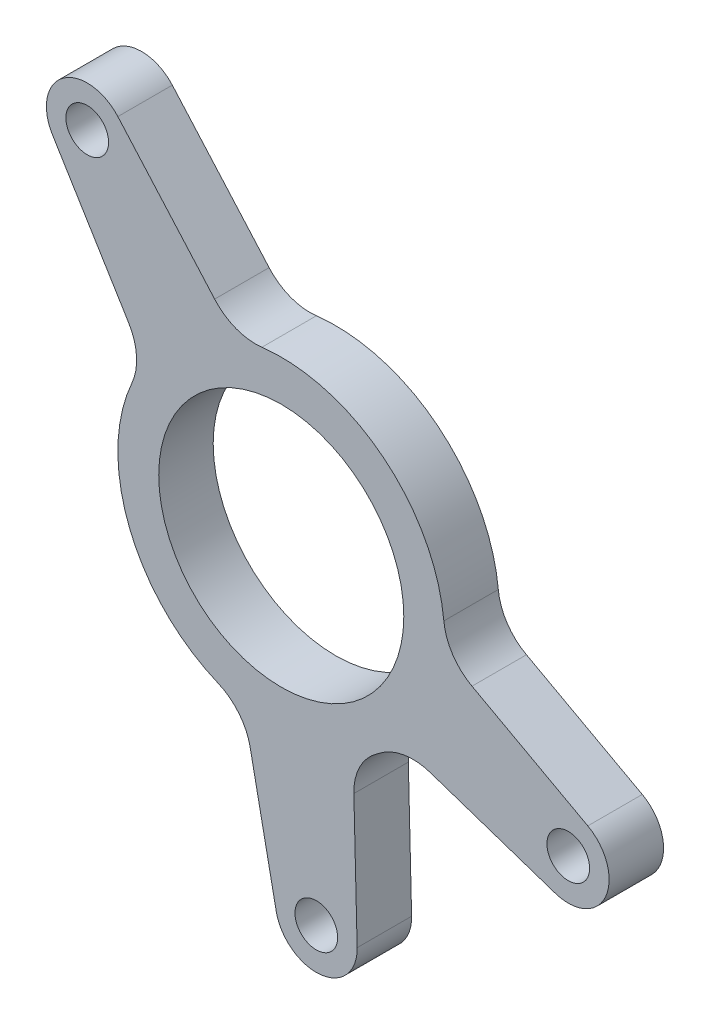
ISO-10303-21;
HEADER;
FILE_DESCRIPTION(('STEP AP214'),'2;1');
FILE_NAME('part.step','',(''),(''),'','','');
FILE_SCHEMA(('AUTOMOTIVE_DESIGN { 1 0 10303 214 1 1 1 1 }'));
ENDSEC;
DATA;
#1=APPLICATION_CONTEXT('core data for automotive mechanical design processes');
#2=APPLICATION_PROTOCOL_DEFINITION('international standard','automotive_design',2000,#1);
#3=PRODUCT_CONTEXT('',#1,'mechanical');
#4=PRODUCT('Part','Part','',(#3));
#5=PRODUCT_RELATED_PRODUCT_CATEGORY('part','',(#4));
#6=PRODUCT_DEFINITION_FORMATION('','',#4);
#7=PRODUCT_DEFINITION_CONTEXT('part definition',#1,'design');
#8=PRODUCT_DEFINITION('design','',#6,#7);
#9=PRODUCT_DEFINITION_SHAPE('','',#8);
#10=(LENGTH_UNIT() NAMED_UNIT(*) SI_UNIT(.MILLI.,.METRE.));
#11=(NAMED_UNIT(*) PLANE_ANGLE_UNIT() SI_UNIT($,.RADIAN.));
#12=(NAMED_UNIT(*) SI_UNIT($,.STERADIAN.) SOLID_ANGLE_UNIT());
#13=UNCERTAINTY_MEASURE_WITH_UNIT(LENGTH_MEASURE(1.E-05),#10,'distance_accuracy_value','');
#14=(GEOMETRIC_REPRESENTATION_CONTEXT(3) GLOBAL_UNCERTAINTY_ASSIGNED_CONTEXT((#13)) GLOBAL_UNIT_ASSIGNED_CONTEXT((#10,
#11,#12)) REPRESENTATION_CONTEXT('',''));
#15=CARTESIAN_POINT('',(0.,0.,0.));
#16=DIRECTION('',(0.,0.,1.));
#17=DIRECTION('',(1.,0.,0.));
#18=AXIS2_PLACEMENT_3D('',#15,#16,#17);
#19=CARTESIAN_POINT('',(403.061726418562,246.285220066651,3.175));
#20=DIRECTION('',(0.853310354906587,0.521403335441186,0.));
#21=DIRECTION('',(-0.521403335441186,0.853310354906587,0.));
#22=AXIS2_PLACEMENT_3D('',#19,#20,#21);
#23=PLANE('',#22);
#24=DIRECTION('',(0.521403335441186,-0.853310354906587,0.));
#25=VECTOR('',#24,1.);
#26=CARTESIAN_POINT('',(403.061726418562,246.285220066651,-3.175));
#27=LINE('',#26,#25);
#28=CARTESIAN_POINT('',(331.623299059515,363.198836954306,-3.175));
#29=VERTEX_POINT('',#28);
#30=CARTESIAN_POINT('',(340.515410137564,348.64632080391,-3.175));
#31=VERTEX_POINT('',#30);
#32=EDGE_CURVE('E226',#29,#31,#27,.T.);
#33=ORIENTED_EDGE('',*,*,#32,.T.);
#34=DIRECTION('',(0.,0.,1.));
#35=VECTOR('',#34,1.);
#36=CARTESIAN_POINT('',(340.515410137564,348.64632080391,3.175));
#37=LINE('',#36,#35);
#38=CARTESIAN_POINT('',(340.515410137564,348.64632080391,3.175));
#39=VERTEX_POINT('',#38);
#40=EDGE_CURVE('E299',#31,#39,#37,.T.);
#41=ORIENTED_EDGE('',*,*,#40,.T.);
#42=DIRECTION('',(0.521403335441186,-0.853310354906587,0.));
#43=VECTOR('',#42,1.);
#44=CARTESIAN_POINT('',(403.061726418562,246.285220066651,3.175));
#45=LINE('',#44,#43);
#46=CARTESIAN_POINT('',(331.623299059515,363.198836954306,3.175));
#47=VERTEX_POINT('',#46);
#48=EDGE_CURVE('E265',#47,#39,#45,.T.);
#49=ORIENTED_EDGE('',*,*,#48,.F.);
#50=DIRECTION('',(0.,0.,-1.));
#51=VECTOR('',#50,1.);
#52=CARTESIAN_POINT('',(331.623299059515,363.198836954306,3.175));
#53=LINE('',#52,#51);
#54=EDGE_CURVE('E225',#47,#29,#53,.T.);
#55=ORIENTED_EDGE('',*,*,#54,.T.);
#56=EDGE_LOOP('',(#33,#41,#49,#55));
#57=FACE_BOUND('',#56,.T.);
#58=ADVANCED_FACE('F41',(#57),#23,.F.);
#59=CARTESIAN_POINT('',(358.310593810549,335.026,3.175));
#60=DIRECTION('',(0.,0.,-1.));
#61=DIRECTION('',(-1.,0.,0.));
#62=AXIS2_PLACEMENT_3D('',#59,#60,#61);
#63=CYLINDRICAL_SURFACE('',#62,19.0499999999999);
#64=CARTESIAN_POINT('',(358.310593810549,335.026,-3.175));
#65=DIRECTION('',(0.,0.,1.));
#66=DIRECTION('',(1.,0.,0.));
#67=AXIS2_PLACEMENT_3D('',#64,#65,#66);
#68=CIRCLE('',#67,19.0499999999999);
#69=CARTESIAN_POINT('',(340.900315490567,342.758057217894,-3.175));
#70=VERTEX_POINT('',#69);
#71=CARTESIAN_POINT('',(350.921592652576,317.467379271495,-3.175));
#72=VERTEX_POINT('',#71);
#73=EDGE_CURVE('E229',#70,#72,#68,.T.);
#74=ORIENTED_EDGE('',*,*,#73,.T.);
#75=DIRECTION('',(0.,0.,-1.));
#76=VECTOR('',#75,1.);
#77=CARTESIAN_POINT('',(350.921592652576,317.467379271495,3.175));
#78=LINE('',#77,#76);
#79=CARTESIAN_POINT('',(350.921592652576,317.467379271495,3.175));
#80=VERTEX_POINT('',#79);
#81=EDGE_CURVE('E297',#72,#80,#78,.F.);
#82=ORIENTED_EDGE('',*,*,#81,.T.);
#83=CARTESIAN_POINT('',(358.310593810549,335.026,3.175));
#84=DIRECTION('',(0.,0.,1.));
#85=DIRECTION('',(1.,0.,0.));
#86=AXIS2_PLACEMENT_3D('',#83,#84,#85);
#87=CIRCLE('',#86,19.0499999999999);
#88=CARTESIAN_POINT('',(340.900315490567,342.758057217894,3.175));
#89=VERTEX_POINT('',#88);
#90=EDGE_CURVE('E179',#89,#80,#87,.T.);
#91=ORIENTED_EDGE('',*,*,#90,.F.);
#92=DIRECTION('',(0.,0.,-1.));
#93=VECTOR('',#92,1.);
#94=CARTESIAN_POINT('',(340.900315490567,342.758057217894,3.175));
#95=LINE('',#94,#93);
#96=EDGE_CURVE('E294',#89,#70,#95,.T.);
#97=ORIENTED_EDGE('',*,*,#96,.T.);
#98=EDGE_LOOP('',(#74,#82,#91,#97));
#99=FACE_BOUND('',#98,.T.);
#100=ADVANCED_FACE('F388',(#99),#63,.T.);
#101=CARTESIAN_POINT('',(401.516879193749,81.1527802401038,3.175));
#102=DIRECTION('',(0.980179887264,0.198109536880818,0.));
#103=DIRECTION('',(-0.198109536880818,0.980179887264,0.));
#104=AXIS2_PLACEMENT_3D('',#101,#102,#103);
#105=PLANE('',#104);
#106=DIRECTION('',(0.198109536880818,-0.980179887264,0.));
#107=VECTOR('',#106,1.);
#108=CARTESIAN_POINT('',(401.516879193749,81.1527802401038,3.175));
#109=LINE('',#108,#107);
#110=CARTESIAN_POINT('',(354.682734550711,312.87250125452,3.175));
#111=VERTEX_POINT('',#110);
#112=CARTESIAN_POINT('',(357.729234982122,297.799433615142,3.175));
#113=VERTEX_POINT('',#112);
#114=EDGE_CURVE('E164',#111,#113,#109,.T.);
#115=ORIENTED_EDGE('',*,*,#114,.F.);
#116=DIRECTION('',(0.,0.,1.));
#117=VECTOR('',#116,1.);
#118=CARTESIAN_POINT('',(354.682734550711,312.87250125452,-3.175));
#119=LINE('',#118,#117);
#120=CARTESIAN_POINT('',(354.682734550711,312.87250125452,-3.175));
#121=VERTEX_POINT('',#120);
#122=EDGE_CURVE('E292',#111,#121,#119,.F.);
#123=ORIENTED_EDGE('',*,*,#122,.T.);
#124=DIRECTION('',(0.198109536880818,-0.980179887264,0.));
#125=VECTOR('',#124,1.);
#126=CARTESIAN_POINT('',(401.516879193749,81.1527802401038,-3.175));
#127=LINE('',#126,#125);
#128=CARTESIAN_POINT('',(357.729234982122,297.799433615142,-3.175));
#129=VERTEX_POINT('',#128);
#130=EDGE_CURVE('E185',#121,#129,#127,.T.);
#131=ORIENTED_EDGE('',*,*,#130,.T.);
#132=DIRECTION('',(0.,0.,-1.));
#133=VECTOR('',#132,1.);
#134=CARTESIAN_POINT('',(357.729234982122,297.799433615142,3.175));
#135=LINE('',#134,#133);
#136=EDGE_CURVE('E182',#113,#129,#135,.T.);
#137=ORIENTED_EDGE('',*,*,#136,.F.);
#138=EDGE_LOOP('',(#115,#123,#131,#137));
#139=FACE_BOUND('',#138,.T.);
#140=ADVANCED_FACE('F183',(#139),#105,.F.);
#141=CARTESIAN_POINT('',(362.397341695217,298.742930284537,3.175));
#142=DIRECTION('',(0.,0.,-1.));
#143=DIRECTION('',(-1.,0.,0.));
#144=AXIS2_PLACEMENT_3D('',#141,#142,#143);
#145=CYLINDRICAL_SURFACE('',#144,4.76250000000001);
#146=CARTESIAN_POINT('',(362.397341695217,298.742930284537,-3.175));
#147=DIRECTION('',(0.,0.,1.));
#148=DIRECTION('',(1.,0.,0.));
#149=AXIS2_PLACEMENT_3D('',#146,#147,#148);
#150=CIRCLE('',#149,4.76250000000001);
#151=CARTESIAN_POINT('',(367.158365855437,298.861484895615,-3.175));
#152=VERTEX_POINT('',#151);
#153=EDGE_CURVE('E235',#129,#152,#150,.T.);
#154=ORIENTED_EDGE('',*,*,#153,.T.);
#155=DIRECTION('',(0.,0.,-1.));
#156=VECTOR('',#155,1.);
#157=CARTESIAN_POINT('',(367.158365855437,298.861484895615,3.175));
#158=LINE('',#157,#156);
#159=CARTESIAN_POINT('',(367.158365855437,298.861484895615,3.175));
#160=VERTEX_POINT('',#159);
#161=EDGE_CURVE('E189',#160,#152,#158,.T.);
#162=ORIENTED_EDGE('',*,*,#161,.F.);
#163=CARTESIAN_POINT('',(362.397341695217,298.742930284537,3.175));
#164=DIRECTION('',(0.,0.,1.));
#165=DIRECTION('',(1.,0.,0.));
#166=AXIS2_PLACEMENT_3D('',#163,#164,#165);
#167=CIRCLE('',#166,4.76250000000001);
#168=EDGE_CURVE('E171',#113,#160,#167,.T.);
#169=ORIENTED_EDGE('',*,*,#168,.F.);
#170=ORIENTED_EDGE('',*,*,#136,.T.);
#171=EDGE_LOOP('',(#154,#162,#169,#170));
#172=FACE_BOUND('',#171,.T.);
#173=ADVANCED_FACE('F191',(#172),#145,.T.);
#174=CARTESIAN_POINT('',(374.368205525174,9.32217008616,3.175));
#175=DIRECTION('',(-0.999690112382013,-0.0248933566567283,0.));
#176=DIRECTION('',(0.0248933566567283,-0.999690112382013,0.));
#177=AXIS2_PLACEMENT_3D('',#174,#175,#176);
#178=PLANE('',#177);
#179=DIRECTION('',(-0.0248933566567283,0.999690112382013,0.));
#180=VECTOR('',#179,1.);
#181=CARTESIAN_POINT('',(374.368205525174,9.32217008616,-3.175));
#182=LINE('',#181,#180);
#183=CARTESIAN_POINT('',(366.775559338456,314.234578016727,-3.175));
#184=VERTEX_POINT('',#183);
#185=EDGE_CURVE('E237',#152,#184,#182,.T.);
#186=ORIENTED_EDGE('',*,*,#185,.T.);
#187=DIRECTION('',(0.,0.,1.));
#188=VECTOR('',#187,1.);
#189=CARTESIAN_POINT('',(366.775559338456,314.234578016727,3.175));
#190=LINE('',#189,#188);
#191=CARTESIAN_POINT('',(366.775559338456,314.234578016727,3.175));
#192=VERTEX_POINT('',#191);
#193=EDGE_CURVE('E290',#184,#192,#190,.T.);
#194=ORIENTED_EDGE('',*,*,#193,.T.);
#195=DIRECTION('',(-0.0248933566567283,0.999690112382013,0.));
#196=VECTOR('',#195,1.);
#197=CARTESIAN_POINT('',(374.368205525174,9.32217008616,3.175));
#198=LINE('',#197,#196);
#199=EDGE_CURVE('E194',#160,#192,#198,.T.);
#200=ORIENTED_EDGE('',*,*,#199,.F.);
#201=ORIENTED_EDGE('',*,*,#161,.T.);
#202=EDGE_LOOP('',(#186,#194,#200,#201));
#203=FACE_BOUND('',#202,.T.);
#204=ADVANCED_FACE('F380',(#203),#178,.F.);
#205=CARTESIAN_POINT('',(369.420342116699,319.550988123623,-3.175));
#206=VERTEX_POINT('',#205);
#207=CARTESIAN_POINT('',(369.822304837863,319.84762692435,-3.175));
#208=VERTEX_POINT('',#207);
#209=EDGE_CURVE('E232',#206,#208,#68,.T.);
#210=ORIENTED_EDGE('',*,*,#209,.T.);
#211=DIRECTION('',(0.,0.,-1.));
#212=VECTOR('',#211,1.);
#213=CARTESIAN_POINT('',(369.822304837863,319.84762692435,3.175));
#214=LINE('',#213,#212);
#215=CARTESIAN_POINT('',(369.822304837863,319.84762692435,3.175));
#216=VERTEX_POINT('',#215);
#217=EDGE_CURVE('E288',#208,#216,#214,.F.);
#218=ORIENTED_EDGE('',*,*,#217,.T.);
#219=CARTESIAN_POINT('',(369.420342116699,319.550988123623,3.175));
#220=VERTEX_POINT('',#219);
#221=EDGE_CURVE('E196',#220,#216,#87,.T.);
#222=ORIENTED_EDGE('',*,*,#221,.F.);
#223=DIRECTION('',(0.,0.,-1.));
#224=VECTOR('',#223,1.);
#225=CARTESIAN_POINT('',(369.420342116699,319.550988123623,3.175));
#226=LINE('',#225,#224);
#227=EDGE_CURVE('E285',#220,#206,#226,.T.);
#228=ORIENTED_EDGE('',*,*,#227,.T.);
#229=EDGE_LOOP('',(#210,#218,#222,#228));
#230=FACE_BOUND('',#229,.T.);
#231=ADVANCED_FACE('F371',(#230),#63,.T.);
#232=CARTESIAN_POINT('',(134.977342209926,401.689953458404,3.175));
#233=DIRECTION('',(-0.318522051961266,-0.947915451089592,0.));
#234=DIRECTION('',(0.947915451089592,-0.318522051961266,0.));
#235=AXIS2_PLACEMENT_3D('',#232,#233,#234);
#236=PLANE('',#235);
#237=DIRECTION('',(-0.947915451089592,0.318522051961266,0.));
#238=VECTOR('',#237,1.);
#239=CARTESIAN_POINT('',(134.977342209926,401.689953458404,3.175));
#240=LINE('',#239,#238);
#241=CARTESIAN_POINT('',(390.25906658129,315.909245293439,3.175));
#242=VERTEX_POINT('',#241);
#243=CARTESIAN_POINT('',(375.682156876922,320.807432346886,3.175));
#244=VERTEX_POINT('',#243);
#245=EDGE_CURVE('E200',#242,#244,#240,.T.);
#246=ORIENTED_EDGE('',*,*,#245,.T.);
#247=DIRECTION('',(0.,0.,-1.));
#248=VECTOR('',#247,1.);
#249=CARTESIAN_POINT('',(375.682156876922,320.807432346886,3.175));
#250=LINE('',#249,#248);
#251=CARTESIAN_POINT('',(375.682156876922,320.807432346886,-3.175));
#252=VERTEX_POINT('',#251);
#253=EDGE_CURVE('E282',#244,#252,#250,.T.);
#254=ORIENTED_EDGE('',*,*,#253,.T.);
#255=DIRECTION('',(-0.947915451089592,0.318522051961266,0.));
#256=VECTOR('',#255,1.);
#257=CARTESIAN_POINT('',(134.977342209926,401.689953458404,-3.175));
#258=LINE('',#257,#256);
#259=CARTESIAN_POINT('',(390.25906658129,315.909245293439,-3.175));
#260=VERTEX_POINT('',#259);
#261=EDGE_CURVE('E240',#260,#252,#258,.T.);
#262=ORIENTED_EDGE('',*,*,#261,.F.);
#263=DIRECTION('',(0.,0.,-1.));
#264=VECTOR('',#263,1.);
#265=CARTESIAN_POINT('',(390.25906658129,315.909245293439,3.175));
#266=LINE('',#265,#264);
#267=EDGE_CURVE('E273',#242,#260,#266,.T.);
#268=ORIENTED_EDGE('',*,*,#267,.F.);
#269=EDGE_LOOP('',(#246,#254,#262,#268));
#270=FACE_BOUND('',#269,.T.);
#271=ADVANCED_FACE('F362',(#270),#236,.T.);
#272=CARTESIAN_POINT('',(391.776027853756,320.423692629253,3.175));
#273=DIRECTION('',(0.,0.,-1.));
#274=DIRECTION('',(-1.,0.,0.));
#275=AXIS2_PLACEMENT_3D('',#272,#273,#274);
#276=CYLINDRICAL_SURFACE('',#275,4.76250000000001);
#277=CARTESIAN_POINT('',(391.776027853756,320.423692629253,-3.175));
#278=DIRECTION('',(0.,0.,1.));
#279=DIRECTION('',(1.,0.,0.));
#280=AXIS2_PLACEMENT_3D('',#277,#278,#279);
#281=CIRCLE('',#280,4.76250000000001);
#282=CARTESIAN_POINT('',(394.053868628936,324.606137805573,-3.175));
#283=VERTEX_POINT('',#282);
#284=EDGE_CURVE('E243',#260,#283,#281,.T.);
#285=ORIENTED_EDGE('',*,*,#284,.T.);
#286=DIRECTION('',(0.,0.,-1.));
#287=VECTOR('',#286,1.);
#288=CARTESIAN_POINT('',(394.053868628936,324.606137805573,3.175));
#289=LINE('',#288,#287);
#290=CARTESIAN_POINT('',(394.053868628936,324.606137805573,3.175));
#291=VERTEX_POINT('',#290);
#292=EDGE_CURVE('E270',#291,#283,#289,.T.);
#293=ORIENTED_EDGE('',*,*,#292,.F.);
#294=CARTESIAN_POINT('',(391.776027853756,320.423692629253,3.175));
#295=DIRECTION('',(0.,0.,1.));
#296=DIRECTION('',(1.,0.,0.));
#297=AXIS2_PLACEMENT_3D('',#294,#295,#296);
#298=CIRCLE('',#297,4.76250000000001);
#299=EDGE_CURVE('E203',#242,#291,#298,.T.);
#300=ORIENTED_EDGE('',*,*,#299,.F.);
#301=ORIENTED_EDGE('',*,*,#267,.T.);
#302=EDGE_LOOP('',(#285,#293,#300,#301));
#303=FACE_BOUND('',#302,.T.);
#304=ADVANCED_FACE('F358',(#303),#276,.T.);
#305=CARTESIAN_POINT('',(226.488432016431,415.865525062562,3.175));
#306=DIRECTION('',(-0.478286776940835,-0.878203711563295,0.));
#307=DIRECTION('',(0.878203711563296,-0.478286776940835,0.));
#308=AXIS2_PLACEMENT_3D('',#305,#306,#307);
#309=PLANE('',#308);
#310=DIRECTION('',(-0.878203711563295,0.478286776940835,0.));
#311=VECTOR('',#310,1.);
#312=CARTESIAN_POINT('',(226.488432016431,415.865525062562,-3.175));
#313=LINE('',#312,#311);
#314=CARTESIAN_POINT('',(380.548976192819,331.961164197691,-3.175));
#315=VERTEX_POINT('',#314);
#316=EDGE_CURVE('E245',#283,#315,#313,.T.);
#317=ORIENTED_EDGE('',*,*,#316,.T.);
#318=DIRECTION('',(0.,0.,1.));
#319=VECTOR('',#318,1.);
#320=CARTESIAN_POINT('',(380.548976192819,331.961164197691,3.175));
#321=LINE('',#320,#319);
#322=CARTESIAN_POINT('',(380.548976192819,331.961164197691,3.175));
#323=VERTEX_POINT('',#322);
#324=EDGE_CURVE('E280',#315,#323,#321,.T.);
#325=ORIENTED_EDGE('',*,*,#324,.T.);
#326=DIRECTION('',(-0.878203711563295,0.478286776940835,0.));
#327=VECTOR('',#326,1.);
#328=CARTESIAN_POINT('',(226.488432016431,415.865525062562,3.175));
#329=LINE('',#328,#327);
#330=EDGE_CURVE('E205',#291,#323,#329,.T.);
#331=ORIENTED_EDGE('',*,*,#330,.F.);
#332=ORIENTED_EDGE('',*,*,#292,.T.);
#333=EDGE_LOOP('',(#317,#325,#331,#332));
#334=FACE_BOUND('',#333,.T.);
#335=ADVANCED_FACE('F353',(#334),#309,.F.);
#336=CARTESIAN_POINT('',(377.267221372432,336.909818324588,3.175));
#337=VERTEX_POINT('',#336);
#338=CARTESIAN_POINT('',(356.055232717659,353.942020890787,3.175));
#339=VERTEX_POINT('',#338);
#340=EDGE_CURVE('E208',#337,#339,#87,.T.);
#341=ORIENTED_EDGE('',*,*,#340,.F.);
#342=DIRECTION('',(0.,0.,-1.));
#343=VECTOR('',#342,1.);
#344=CARTESIAN_POINT('',(377.267221372432,336.909818324588,3.175));
#345=LINE('',#344,#343);
#346=CARTESIAN_POINT('',(377.267221372432,336.909818324588,-3.175));
#347=VERTEX_POINT('',#346);
#348=EDGE_CURVE('E277',#337,#347,#345,.T.);
#349=ORIENTED_EDGE('',*,*,#348,.T.);
#350=CARTESIAN_POINT('',(356.055232717659,353.942020890787,-3.175));
#351=VERTEX_POINT('',#350);
#352=EDGE_CURVE('E233',#347,#351,#68,.T.);
#353=ORIENTED_EDGE('',*,*,#352,.T.);
#354=DIRECTION('',(0.,0.,-1.));
#355=VECTOR('',#354,1.);
#356=CARTESIAN_POINT('',(356.055232717659,353.942020890787,3.175));
#357=LINE('',#356,#355);
#358=EDGE_CURVE('E188',#351,#339,#357,.F.);
#359=ORIENTED_EDGE('',*,*,#358,.T.);
#360=EDGE_LOOP('',(#341,#349,#353,#359));
#361=FACE_BOUND('',#360,.T.);
#362=ADVANCED_FACE('F331',(#361),#63,.T.);
#363=CARTESIAN_POINT('',(373.717599500617,329.782912103385,3.175));
#364=DIRECTION('',(0.749805914208794,0.661657835302745,0.));
#365=DIRECTION('',(-0.661657835302745,0.749805914208794,0.));
#366=AXIS2_PLACEMENT_3D('',#363,#364,#365);
#367=PLANE('',#366);
#368=DIRECTION('',(0.661657835302745,-0.749805914208794,0.));
#369=VECTOR('',#368,1.);
#370=CARTESIAN_POINT('',(373.717599500617,329.782912103385,3.175));
#371=LINE('',#370,#369);
#372=CARTESIAN_POINT('',(339.258140291177,368.833165779974,3.175));
#373=VERTEX_POINT('',#372);
#374=CARTESIAN_POINT('',(350.54217813147,356.045833933543,3.175));
#375=VERTEX_POINT('',#374);
#376=EDGE_CURVE('E209',#373,#375,#371,.T.);
#377=ORIENTED_EDGE('',*,*,#376,.T.);
#378=DIRECTION('',(0.,0.,-1.));
#379=VECTOR('',#378,1.);
#380=CARTESIAN_POINT('',(350.54217813147,356.045833933543,3.175));
#381=LINE('',#380,#379);
#382=CARTESIAN_POINT('',(350.54217813147,356.045833933543,-3.175));
#383=VERTEX_POINT('',#382);
#384=EDGE_CURVE('E301',#375,#383,#381,.T.);
#385=ORIENTED_EDGE('',*,*,#384,.T.);
#386=DIRECTION('',(0.661657835302745,-0.749805914208794,0.));
#387=VECTOR('',#386,1.);
#388=CARTESIAN_POINT('',(373.717599500617,329.782912103385,-3.175));
#389=LINE('',#388,#387);
#390=CARTESIAN_POINT('',(339.258140291177,368.833165779974,-3.175));
#391=VERTEX_POINT('',#390);
#392=EDGE_CURVE('E248',#391,#383,#389,.T.);
#393=ORIENTED_EDGE('',*,*,#392,.F.);
#394=DIRECTION('',(0.,0.,-1.));
#395=VECTOR('',#394,1.);
#396=CARTESIAN_POINT('',(339.258140291177,368.833165779974,3.175));
#397=LINE('',#396,#395);
#398=EDGE_CURVE('E268',#373,#391,#397,.T.);
#399=ORIENTED_EDGE('',*,*,#398,.F.);
#400=EDGE_LOOP('',(#377,#385,#393,#399));
#401=FACE_BOUND('',#400,.T.);
#402=ADVANCED_FACE('F334',(#401),#367,.T.);
#403=CARTESIAN_POINT('',(362.397341695217,298.742930284537,3.175));
#404=DIRECTION('',(0.,0.,-1.));
#405=DIRECTION('',(-1.,0.,0.));
#406=AXIS2_PLACEMENT_3D('',#403,#404,#405);
#407=CYLINDRICAL_SURFACE('',#406,2.48920000000001);
#408=CARTESIAN_POINT('',(362.397341695217,298.742930284537,3.175));
#409=DIRECTION('',(0.,0.,1.));
#410=DIRECTION('',(1.,0.,0.));
#411=AXIS2_PLACEMENT_3D('',#408,#409,#410);
#412=CIRCLE('',#411,2.48920000000001);
#413=CARTESIAN_POINT('',(364.886541695217,298.742930284537,3.175));
#414=VERTEX_POINT('',#413);
#415=EDGE_CURVE('E219',#414,#414,#412,.T.);
#416=ORIENTED_EDGE('',*,*,#415,.T.);
#417=EDGE_LOOP('',(#416));
#418=FACE_BOUND('',#417,.T.);
#419=CARTESIAN_POINT('',(362.397341695217,298.742930284537,-3.175));
#420=DIRECTION('',(0.,0.,1.));
#421=DIRECTION('',(1.,0.,0.));
#422=AXIS2_PLACEMENT_3D('',#419,#420,#421);
#423=CIRCLE('',#422,2.48920000000001);
#424=CARTESIAN_POINT('',(364.886541695217,298.742930284537,-3.175));
#425=VERTEX_POINT('',#424);
#426=EDGE_CURVE('E259',#425,#425,#423,.T.);
#427=ORIENTED_EDGE('',*,*,#426,.F.);
#428=EDGE_LOOP('',(#427));
#429=FACE_BOUND('',#428,.T.);
#430=ADVANCED_FACE('F477',(#418,#429),#407,.F.);
#431=CARTESIAN_POINT('',(358.310593810549,335.026,3.175));
#432=DIRECTION('',(0.,0.,-1.));
#433=DIRECTION('',(-1.,0.,0.));
#434=AXIS2_PLACEMENT_3D('',#431,#432,#433);
#435=CYLINDRICAL_SURFACE('',#434,14.2875);
#436=CARTESIAN_POINT('',(358.310593810549,335.026,3.175));
#437=DIRECTION('',(0.,0.,1.));
#438=DIRECTION('',(1.,0.,0.));
#439=AXIS2_PLACEMENT_3D('',#436,#437,#438);
#440=CIRCLE('',#439,14.2875);
#441=CARTESIAN_POINT('',(372.598093810549,335.026,3.175));
#442=VERTEX_POINT('',#441);
#443=EDGE_CURVE('E216',#442,#442,#440,.T.);
#444=ORIENTED_EDGE('',*,*,#443,.T.);
#445=EDGE_LOOP('',(#444));
#446=FACE_BOUND('',#445,.T.);
#447=CARTESIAN_POINT('',(358.310593810549,335.026,-3.175));
#448=DIRECTION('',(0.,0.,1.));
#449=DIRECTION('',(1.,0.,0.));
#450=AXIS2_PLACEMENT_3D('',#447,#448,#449);
#451=CIRCLE('',#450,14.2875);
#452=CARTESIAN_POINT('',(372.598093810549,335.026,-3.175));
#453=VERTEX_POINT('',#452);
#454=EDGE_CURVE('E256',#453,#453,#451,.T.);
#455=ORIENTED_EDGE('',*,*,#454,.F.);
#456=EDGE_LOOP('',(#455));
#457=FACE_BOUND('',#456,.T.);
#458=ADVANCED_FACE('F543',(#446,#457),#435,.F.);
#459=CARTESIAN_POINT('',(335.687189624758,365.682020339345,3.175));
#460=DIRECTION('',(0.,0.,-1.));
#461=DIRECTION('',(-1.,0.,0.));
#462=AXIS2_PLACEMENT_3D('',#459,#460,#461);
#463=CYLINDRICAL_SURFACE('',#462,2.48920000000001);
#464=CARTESIAN_POINT('',(335.687189624758,365.682020339345,3.175));
#465=DIRECTION('',(0.,0.,1.));
#466=DIRECTION('',(1.,0.,0.));
#467=AXIS2_PLACEMENT_3D('',#464,#465,#466);
#468=CIRCLE('',#467,2.48920000000001);
#469=CARTESIAN_POINT('',(338.176389624758,365.682020339345,3.175));
#470=VERTEX_POINT('',#469);
#471=EDGE_CURVE('E213',#470,#470,#468,.T.);
#472=ORIENTED_EDGE('',*,*,#471,.T.);
#473=EDGE_LOOP('',(#472));
#474=FACE_BOUND('',#473,.T.);
#475=CARTESIAN_POINT('',(335.687189624758,365.682020339345,-3.175));
#476=DIRECTION('',(0.,0.,1.));
#477=DIRECTION('',(1.,0.,0.));
#478=AXIS2_PLACEMENT_3D('',#475,#476,#477);
#479=CIRCLE('',#478,2.48920000000001);
#480=CARTESIAN_POINT('',(338.176389624758,365.682020339345,-3.175));
#481=VERTEX_POINT('',#480);
#482=EDGE_CURVE('E253',#481,#481,#479,.T.);
#483=ORIENTED_EDGE('',*,*,#482,.F.);
#484=EDGE_LOOP('',(#483));
#485=FACE_BOUND('',#484,.T.);
#486=ADVANCED_FACE('F552',(#474,#485),#463,.F.);
#487=CARTESIAN_POINT('',(335.687189624758,365.682020339345,3.175));
#488=DIRECTION('',(0.,0.,-1.));
#489=DIRECTION('',(-1.,0.,0.));
#490=AXIS2_PLACEMENT_3D('',#487,#488,#489);
#491=CYLINDRICAL_SURFACE('',#490,4.76250000000001);
#492=CARTESIAN_POINT('',(335.687189624758,365.682020339345,-3.175));
#493=DIRECTION('',(0.,0.,1.));
#494=DIRECTION('',(1.,0.,0.));
#495=AXIS2_PLACEMENT_3D('',#492,#493,#494);
#496=CIRCLE('',#495,4.76250000000001);
#497=EDGE_CURVE('E251',#391,#29,#496,.T.);
#498=ORIENTED_EDGE('',*,*,#497,.T.);
#499=ORIENTED_EDGE('',*,*,#54,.F.);
#500=CARTESIAN_POINT('',(335.687189624758,365.682020339345,3.175));
#501=DIRECTION('',(0.,0.,1.));
#502=DIRECTION('',(1.,0.,0.));
#503=AXIS2_PLACEMENT_3D('',#500,#501,#502);
#504=CIRCLE('',#503,4.76250000000001);
#505=EDGE_CURVE('E211',#373,#47,#504,.T.);
#506=ORIENTED_EDGE('',*,*,#505,.F.);
#507=ORIENTED_EDGE('',*,*,#398,.T.);
#508=EDGE_LOOP('',(#498,#499,#506,#507));
#509=FACE_BOUND('',#508,.T.);
#510=ADVANCED_FACE('F340',(#509),#491,.T.);
#511=CARTESIAN_POINT('',(391.776027853756,320.423692629253,3.175));
#512=DIRECTION('',(0.,0.,-1.));
#513=DIRECTION('',(-1.,0.,0.));
#514=AXIS2_PLACEMENT_3D('',#511,#512,#513);
#515=CYLINDRICAL_SURFACE('',#514,2.48920000000001);
#516=CARTESIAN_POINT('',(391.776027853756,320.423692629253,3.175));
#517=DIRECTION('',(0.,0.,1.));
#518=DIRECTION('',(1.,0.,0.));
#519=AXIS2_PLACEMENT_3D('',#516,#517,#518);
#520=CIRCLE('',#519,2.48920000000001);
#521=CARTESIAN_POINT('',(394.265227853756,320.423692629253,3.175));
#522=VERTEX_POINT('',#521);
#523=EDGE_CURVE('E222',#522,#522,#520,.T.);
#524=ORIENTED_EDGE('',*,*,#523,.T.);
#525=EDGE_LOOP('',(#524));
#526=FACE_BOUND('',#525,.T.);
#527=CARTESIAN_POINT('',(391.776027853756,320.423692629253,-3.175));
#528=DIRECTION('',(0.,0.,1.));
#529=DIRECTION('',(1.,0.,0.));
#530=AXIS2_PLACEMENT_3D('',#527,#528,#529);
#531=CIRCLE('',#530,2.48920000000001);
#532=CARTESIAN_POINT('',(394.265227853756,320.423692629253,-3.175));
#533=VERTEX_POINT('',#532);
#534=EDGE_CURVE('E262',#533,#533,#531,.T.);
#535=ORIENTED_EDGE('',*,*,#534,.F.);
#536=EDGE_LOOP('',(#535));
#537=FACE_BOUND('',#536,.T.);
#538=ADVANCED_FACE('F468',(#526,#537),#515,.F.);
#539=CARTESIAN_POINT('',(0.,0.,3.175));
#540=DIRECTION('',(0.,0.,1.));
#541=DIRECTION('',(1.,0.,0.));
#542=AXIS2_PLACEMENT_3D('',#539,#540,#541);
#543=PLANE('',#542);
#544=ORIENTED_EDGE('',*,*,#48,.T.);
#545=CARTESIAN_POINT('',(335.096889383907,345.335409623858,3.175));
#546=DIRECTION('',(0.,0.,1.));
#547=DIRECTION('',(1.,0.,0.));
#548=AXIS2_PLACEMENT_3D('',#545,#546,#547);
#549=CIRCLE('',#548,6.35);
#550=EDGE_CURVE('E320',#39,#89,#549,.F.);
#551=ORIENTED_EDGE('',*,*,#550,.T.);
#552=ORIENTED_EDGE('',*,*,#90,.T.);
#553=CARTESIAN_POINT('',(348.458592266585,311.614505695327,3.175));
#554=DIRECTION('',(0.,0.,1.));
#555=DIRECTION('',(1.,0.,0.));
#556=AXIS2_PLACEMENT_3D('',#553,#554,#555);
#557=CIRCLE('',#556,6.35);
#558=EDGE_CURVE('E175',#80,#111,#557,.F.);
#559=ORIENTED_EDGE('',*,*,#558,.T.);
#560=ORIENTED_EDGE('',*,*,#114,.T.);
#561=ORIENTED_EDGE('',*,*,#168,.T.);
#562=ORIENTED_EDGE('',*,*,#199,.T.);
#563=CARTESIAN_POINT('',(373.123591552082,314.392650831498,3.175));
#564=DIRECTION('',(0.,0.,1.));
#565=DIRECTION('',(1.,0.,0.));
#566=AXIS2_PLACEMENT_3D('',#563,#564,#565);
#567=CIRCLE('',#566,6.35);
#568=EDGE_CURVE('E313',#192,#220,#567,.F.);
#569=ORIENTED_EDGE('',*,*,#568,.T.);
#570=ORIENTED_EDGE('',*,*,#221,.T.);
#571=CARTESIAN_POINT('',(373.659541846968,314.788169232467,3.175));
#572=DIRECTION('',(0.,0.,1.));
#573=DIRECTION('',(1.,0.,0.));
#574=AXIS2_PLACEMENT_3D('',#571,#572,#573);
#575=CIRCLE('',#574,6.35);
#576=EDGE_CURVE('E309',#216,#244,#575,.F.);
#577=ORIENTED_EDGE('',*,*,#576,.T.);
#578=ORIENTED_EDGE('',*,*,#245,.F.);
#579=ORIENTED_EDGE('',*,*,#299,.T.);
#580=ORIENTED_EDGE('',*,*,#330,.T.);
#581=CARTESIAN_POINT('',(383.586097226393,337.537757766118,3.175));
#582=DIRECTION('',(0.,0.,1.));
#583=DIRECTION('',(1.,0.,0.));
#584=AXIS2_PLACEMENT_3D('',#581,#582,#583);
#585=CIRCLE('',#584,6.35);
#586=EDGE_CURVE('E305',#323,#337,#585,.F.);
#587=ORIENTED_EDGE('',*,*,#586,.T.);
#588=ORIENTED_EDGE('',*,*,#340,.T.);
#589=CARTESIAN_POINT('',(355.303445686696,360.247361187716,3.175));
#590=DIRECTION('',(0.,0.,1.));
#591=DIRECTION('',(1.,0.,0.));
#592=AXIS2_PLACEMENT_3D('',#589,#590,#591);
#593=CIRCLE('',#592,6.35);
#594=EDGE_CURVE('E11',#339,#375,#593,.F.);
#595=ORIENTED_EDGE('',*,*,#594,.T.);
#596=ORIENTED_EDGE('',*,*,#376,.F.);
#597=ORIENTED_EDGE('',*,*,#505,.T.);
#598=EDGE_LOOP('',(#544,#551,#552,#559,#560,#561,#562,#569,#570,#577,#578,#579,#580,#587,#588,
#595,#596,#597));
#599=FACE_BOUND('',#598,.T.);
#600=ORIENTED_EDGE('',*,*,#471,.F.);
#601=EDGE_LOOP('',(#600));
#602=FACE_BOUND('',#601,.T.);
#603=ORIENTED_EDGE('',*,*,#443,.F.);
#604=EDGE_LOOP('',(#603));
#605=FACE_BOUND('',#604,.T.);
#606=ORIENTED_EDGE('',*,*,#415,.F.);
#607=EDGE_LOOP('',(#606));
#608=FACE_BOUND('',#607,.T.);
#609=ORIENTED_EDGE('',*,*,#523,.F.);
#610=EDGE_LOOP('',(#609));
#611=FACE_BOUND('',#610,.T.);
#612=ADVANCED_FACE('F167',(#599,#602,#605,#608,#611),#543,.T.);
#613=CARTESIAN_POINT('',(0.,0.,-3.175));
#614=DIRECTION('',(0.,0.,1.));
#615=DIRECTION('',(1.,0.,0.));
#616=AXIS2_PLACEMENT_3D('',#613,#614,#615);
#617=PLANE('',#616);
#618=ORIENTED_EDGE('',*,*,#32,.F.);
#619=ORIENTED_EDGE('',*,*,#497,.F.);
#620=ORIENTED_EDGE('',*,*,#392,.T.);
#621=CARTESIAN_POINT('',(355.303445686696,360.247361187716,-3.175));
#622=DIRECTION('',(0.,0.,1.));
#623=DIRECTION('',(1.,0.,0.));
#624=AXIS2_PLACEMENT_3D('',#621,#622,#623);
#625=CIRCLE('',#624,6.35);
#626=EDGE_CURVE('E49',#383,#351,#625,.T.);
#627=ORIENTED_EDGE('',*,*,#626,.T.);
#628=ORIENTED_EDGE('',*,*,#352,.F.);
#629=CARTESIAN_POINT('',(383.586097226393,337.537757766118,-3.175));
#630=DIRECTION('',(0.,0.,1.));
#631=DIRECTION('',(1.,0.,0.));
#632=AXIS2_PLACEMENT_3D('',#629,#630,#631);
#633=CIRCLE('',#632,6.35);
#634=EDGE_CURVE('E303',#347,#315,#633,.T.);
#635=ORIENTED_EDGE('',*,*,#634,.T.);
#636=ORIENTED_EDGE('',*,*,#316,.F.);
#637=ORIENTED_EDGE('',*,*,#284,.F.);
#638=ORIENTED_EDGE('',*,*,#261,.T.);
#639=CARTESIAN_POINT('',(373.659541846968,314.788169232467,-3.175));
#640=DIRECTION('',(0.,0.,1.));
#641=DIRECTION('',(1.,0.,0.));
#642=AXIS2_PLACEMENT_3D('',#639,#640,#641);
#643=CIRCLE('',#642,6.35);
#644=EDGE_CURVE('E307',#252,#208,#643,.T.);
#645=ORIENTED_EDGE('',*,*,#644,.T.);
#646=ORIENTED_EDGE('',*,*,#209,.F.);
#647=CARTESIAN_POINT('',(373.123591552082,314.392650831498,-3.175));
#648=DIRECTION('',(0.,0.,1.));
#649=DIRECTION('',(1.,0.,0.));
#650=AXIS2_PLACEMENT_3D('',#647,#648,#649);
#651=CIRCLE('',#650,6.35);
#652=EDGE_CURVE('E311',#206,#184,#651,.T.);
#653=ORIENTED_EDGE('',*,*,#652,.T.);
#654=ORIENTED_EDGE('',*,*,#185,.F.);
#655=ORIENTED_EDGE('',*,*,#153,.F.);
#656=ORIENTED_EDGE('',*,*,#130,.F.);
#657=CARTESIAN_POINT('',(348.458592266585,311.614505695327,-3.175));
#658=DIRECTION('',(0.,0.,1.));
#659=DIRECTION('',(1.,0.,0.));
#660=AXIS2_PLACEMENT_3D('',#657,#658,#659);
#661=CIRCLE('',#660,6.35);
#662=EDGE_CURVE('E315',#121,#72,#661,.T.);
#663=ORIENTED_EDGE('',*,*,#662,.T.);
#664=ORIENTED_EDGE('',*,*,#73,.F.);
#665=CARTESIAN_POINT('',(335.096889383907,345.335409623858,-3.175));
#666=DIRECTION('',(0.,0.,1.));
#667=DIRECTION('',(1.,0.,0.));
#668=AXIS2_PLACEMENT_3D('',#665,#666,#667);
#669=CIRCLE('',#668,6.35);
#670=EDGE_CURVE('E318',#70,#31,#669,.T.);
#671=ORIENTED_EDGE('',*,*,#670,.T.);
#672=EDGE_LOOP('',(#618,#619,#620,#627,#628,#635,#636,#637,#638,#645,#646,#653,#654,#655,#656,
#663,#664,#671));
#673=FACE_BOUND('',#672,.T.);
#674=ORIENTED_EDGE('',*,*,#482,.T.);
#675=EDGE_LOOP('',(#674));
#676=FACE_BOUND('',#675,.T.);
#677=ORIENTED_EDGE('',*,*,#454,.T.);
#678=EDGE_LOOP('',(#677));
#679=FACE_BOUND('',#678,.T.);
#680=ORIENTED_EDGE('',*,*,#426,.T.);
#681=EDGE_LOOP('',(#680));
#682=FACE_BOUND('',#681,.T.);
#683=ORIENTED_EDGE('',*,*,#534,.T.);
#684=EDGE_LOOP('',(#683));
#685=FACE_BOUND('',#684,.T.);
#686=ADVANCED_FACE('F325',(#673,#676,#679,#682,#685),#617,.F.);
#687=CARTESIAN_POINT('',(383.586097226393,337.537757766118,3.175));
#688=DIRECTION('',(0.,0.,-1.));
#689=DIRECTION('',(-1.,0.,0.));
#690=AXIS2_PLACEMENT_3D('',#687,#688,#689);
#691=CYLINDRICAL_SURFACE('',#690,6.35);
#692=ORIENTED_EDGE('',*,*,#586,.F.);
#693=ORIENTED_EDGE('',*,*,#324,.F.);
#694=ORIENTED_EDGE('',*,*,#634,.F.);
#695=ORIENTED_EDGE('',*,*,#348,.F.);
#696=EDGE_LOOP('',(#692,#693,#694,#695));
#697=FACE_BOUND('',#696,.T.);
#698=ADVANCED_FACE('F348',(#697),#691,.F.);
#699=CARTESIAN_POINT('',(373.659541846968,314.788169232467,3.175));
#700=DIRECTION('',(0.,0.,-1.));
#701=DIRECTION('',(-1.,0.,0.));
#702=AXIS2_PLACEMENT_3D('',#699,#700,#701);
#703=CYLINDRICAL_SURFACE('',#702,6.35);
#704=ORIENTED_EDGE('',*,*,#576,.F.);
#705=ORIENTED_EDGE('',*,*,#217,.F.);
#706=ORIENTED_EDGE('',*,*,#644,.F.);
#707=ORIENTED_EDGE('',*,*,#253,.F.);
#708=EDGE_LOOP('',(#704,#705,#706,#707));
#709=FACE_BOUND('',#708,.T.);
#710=ADVANCED_FACE('F366',(#709),#703,.F.);
#711=CARTESIAN_POINT('',(373.123591552082,314.392650831498,3.175));
#712=DIRECTION('',(0.,0.,-1.));
#713=DIRECTION('',(-1.,0.,0.));
#714=AXIS2_PLACEMENT_3D('',#711,#712,#713);
#715=CYLINDRICAL_SURFACE('',#714,6.35);
#716=ORIENTED_EDGE('',*,*,#568,.F.);
#717=ORIENTED_EDGE('',*,*,#193,.F.);
#718=ORIENTED_EDGE('',*,*,#652,.F.);
#719=ORIENTED_EDGE('',*,*,#227,.F.);
#720=EDGE_LOOP('',(#716,#717,#718,#719));
#721=FACE_BOUND('',#720,.T.);
#722=ADVANCED_FACE('F376',(#721),#715,.F.);
#723=CARTESIAN_POINT('',(348.458592266585,311.614505695327,3.175));
#724=DIRECTION('',(0.,0.,-1.));
#725=DIRECTION('',(-1.,0.,0.));
#726=AXIS2_PLACEMENT_3D('',#723,#724,#725);
#727=CYLINDRICAL_SURFACE('',#726,6.35);
#728=ORIENTED_EDGE('',*,*,#558,.F.);
#729=ORIENTED_EDGE('',*,*,#81,.F.);
#730=ORIENTED_EDGE('',*,*,#662,.F.);
#731=ORIENTED_EDGE('',*,*,#122,.F.);
#732=EDGE_LOOP('',(#728,#729,#730,#731));
#733=FACE_BOUND('',#732,.T.);
#734=ADVANCED_FACE('F407',(#733),#727,.F.);
#735=CARTESIAN_POINT('',(335.096889383907,345.335409623858,3.175));
#736=DIRECTION('',(0.,0.,-1.));
#737=DIRECTION('',(-1.,0.,0.));
#738=AXIS2_PLACEMENT_3D('',#735,#736,#737);
#739=CYLINDRICAL_SURFACE('',#738,6.35);
#740=ORIENTED_EDGE('',*,*,#550,.F.);
#741=ORIENTED_EDGE('',*,*,#40,.F.);
#742=ORIENTED_EDGE('',*,*,#670,.F.);
#743=ORIENTED_EDGE('',*,*,#96,.F.);
#744=EDGE_LOOP('',(#740,#741,#742,#743));
#745=FACE_BOUND('',#744,.T.);
#746=ADVANCED_FACE('F409',(#745),#739,.F.);
#747=CARTESIAN_POINT('',(355.303445686696,360.247361187716,3.175));
#748=DIRECTION('',(0.,0.,-1.));
#749=DIRECTION('',(-1.,0.,0.));
#750=AXIS2_PLACEMENT_3D('',#747,#748,#749);
#751=CYLINDRICAL_SURFACE('',#750,6.35);
#752=ORIENTED_EDGE('',*,*,#594,.F.);
#753=ORIENTED_EDGE('',*,*,#358,.F.);
#754=ORIENTED_EDGE('',*,*,#626,.F.);
#755=ORIENTED_EDGE('',*,*,#384,.F.);
#756=EDGE_LOOP('',(#752,#753,#754,#755));
#757=FACE_BOUND('',#756,.T.);
#758=ADVANCED_FACE('F43',(#757),#751,.F.);
#759=CLOSED_SHELL('',(#58,#100,#140,#173,#204,#231,#271,#304,#335,#362,#402,#430,#458,#486,#510,
#538,#612,#686,#698,#710,#722,#734,#746,#758));
#760=MANIFOLD_SOLID_BREP('B2',#759);
#761=ADVANCED_BREP_SHAPE_REPRESENTATION('',(#18,#760),#14);
#762=SHAPE_DEFINITION_REPRESENTATION(#9,#761);
ENDSEC;
END-ISO-10303-21;
